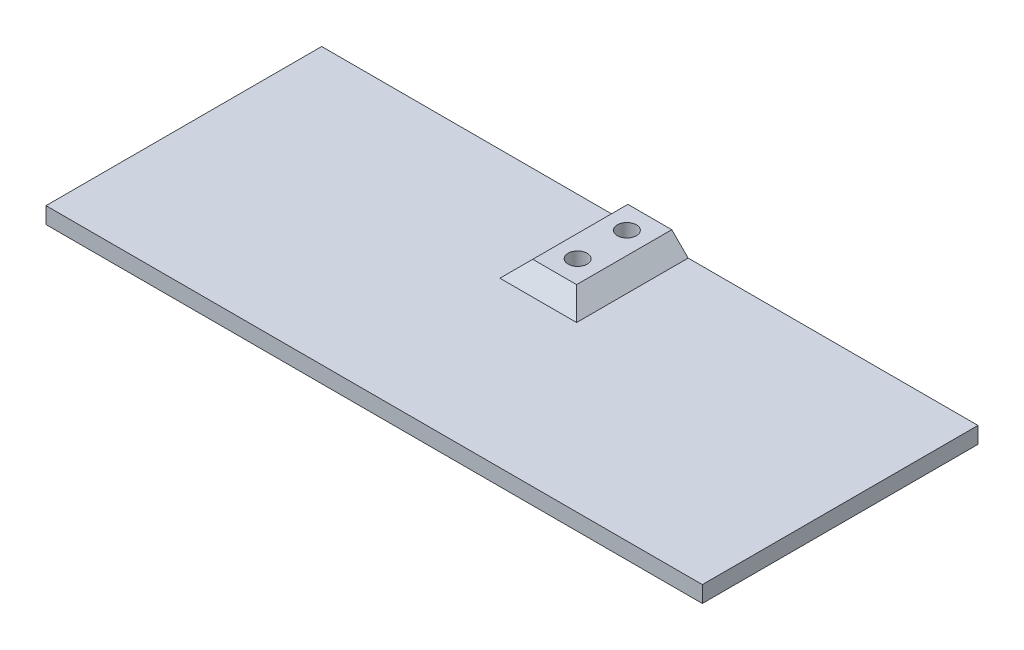
ISO-10303-21;
HEADER;
FILE_DESCRIPTION(('STEP AP214'),'2;1');
FILE_NAME('part.step','',(''),(''),'','','');
FILE_SCHEMA(('AUTOMOTIVE_DESIGN { 1 0 10303 214 1 1 1 1 }'));
ENDSEC;
DATA;
#1=APPLICATION_CONTEXT('core data for automotive mechanical design processes');
#2=APPLICATION_PROTOCOL_DEFINITION('international standard','automotive_design',2000,#1);
#3=PRODUCT_CONTEXT('',#1,'mechanical');
#4=PRODUCT('Part','Part','',(#3));
#5=PRODUCT_RELATED_PRODUCT_CATEGORY('part','',(#4));
#6=PRODUCT_DEFINITION_FORMATION('','',#4);
#7=PRODUCT_DEFINITION_CONTEXT('part definition',#1,'design');
#8=PRODUCT_DEFINITION('design','',#6,#7);
#9=PRODUCT_DEFINITION_SHAPE('','',#8);
#10=(LENGTH_UNIT() NAMED_UNIT(*) SI_UNIT(.MILLI.,.METRE.));
#11=(NAMED_UNIT(*) PLANE_ANGLE_UNIT() SI_UNIT($,.RADIAN.));
#12=(NAMED_UNIT(*) SI_UNIT($,.STERADIAN.) SOLID_ANGLE_UNIT());
#13=UNCERTAINTY_MEASURE_WITH_UNIT(LENGTH_MEASURE(1.E-05),#10,'distance_accuracy_value','');
#14=(GEOMETRIC_REPRESENTATION_CONTEXT(3) GLOBAL_UNCERTAINTY_ASSIGNED_CONTEXT((#13)) GLOBAL_UNIT_ASSIGNED_CONTEXT((#10,
#11,#12)) REPRESENTATION_CONTEXT('',''));
#15=CARTESIAN_POINT('',(0.,0.,0.));
#16=DIRECTION('',(0.,0.,1.));
#17=DIRECTION('',(1.,0.,0.));
#18=AXIS2_PLACEMENT_3D('',#15,#16,#17);
#19=CARTESIAN_POINT('',(0.,5.,0.));
#20=DIRECTION('',(0.,-1.,0.));
#21=DIRECTION('',(0.,0.,-1.));
#22=AXIS2_PLACEMENT_3D('',#19,#20,#21);
#23=PLANE('',#22);
#24=DIRECTION('',(-1.,0.,0.));
#25=VECTOR('',#24,1.);
#26=CARTESIAN_POINT('',(-6.68756530825497,5.,-8.00000000000002));
#27=LINE('',#26,#25);
#28=CARTESIAN_POINT('',(11.6875653082549,5.,-8.00000000000003));
#29=VERTEX_POINT('',#28);
#30=CARTESIAN_POINT('',(-11.6875653082549,5.,-8.00000000000002));
#31=VERTEX_POINT('',#30);
#32=EDGE_CURVE('E64',#29,#31,#27,.T.);
#33=ORIENTED_EDGE('',*,*,#32,.T.);
#34=DIRECTION('',(0.,0.,-1.));
#35=VECTOR('',#34,1.);
#36=CARTESIAN_POINT('',(-11.6875653082549,5.,-42.));
#37=LINE('',#36,#35);
#38=CARTESIAN_POINT('',(-11.6875653082549,5.,-42.));
#39=VERTEX_POINT('',#38);
#40=EDGE_CURVE('E119',#31,#39,#37,.T.);
#41=ORIENTED_EDGE('',*,*,#40,.T.);
#42=DIRECTION('',(-1.,0.,0.));
#43=VECTOR('',#42,1.);
#44=CARTESIAN_POINT('',(-100.,5.,-42.));
#45=LINE('',#44,#43);
#46=CARTESIAN_POINT('',(-100.,5.,-42.));
#47=VERTEX_POINT('',#46);
#48=EDGE_CURVE('E152',#39,#47,#45,.T.);
#49=ORIENTED_EDGE('',*,*,#48,.T.);
#50=DIRECTION('',(0.,0.,1.));
#51=VECTOR('',#50,1.);
#52=CARTESIAN_POINT('',(-100.,5.,42.));
#53=LINE('',#52,#51);
#54=CARTESIAN_POINT('',(-100.,5.,42.));
#55=VERTEX_POINT('',#54);
#56=EDGE_CURVE('E157',#47,#55,#53,.T.);
#57=ORIENTED_EDGE('',*,*,#56,.T.);
#58=DIRECTION('',(1.,0.,0.));
#59=VECTOR('',#58,1.);
#60=CARTESIAN_POINT('',(-100.,5.,42.));
#61=LINE('',#60,#59);
#62=CARTESIAN_POINT('',(100.,5.,42.));
#63=VERTEX_POINT('',#62);
#64=EDGE_CURVE('E160',#55,#63,#61,.T.);
#65=ORIENTED_EDGE('',*,*,#64,.T.);
#66=DIRECTION('',(0.,0.,-1.));
#67=VECTOR('',#66,1.);
#68=CARTESIAN_POINT('',(100.,5.,42.));
#69=LINE('',#68,#67);
#70=CARTESIAN_POINT('',(100.,5.,-42.));
#71=VERTEX_POINT('',#70);
#72=EDGE_CURVE('E148',#63,#71,#69,.T.);
#73=ORIENTED_EDGE('',*,*,#72,.T.);
#74=CARTESIAN_POINT('',(11.6875653082549,5.,-42.));
#75=VERTEX_POINT('',#74);
#76=EDGE_CURVE('E154',#71,#75,#45,.T.);
#77=ORIENTED_EDGE('',*,*,#76,.T.);
#78=DIRECTION('',(0.,0.,1.));
#79=VECTOR('',#78,1.);
#80=CARTESIAN_POINT('',(11.6875653082549,5.,-13.));
#81=LINE('',#80,#79);
#82=EDGE_CURVE('E69',#75,#29,#81,.T.);
#83=ORIENTED_EDGE('',*,*,#82,.T.);
#84=EDGE_LOOP('',(#33,#41,#49,#57,#65,#73,#77,#83));
#85=FACE_BOUND('',#84,.T.);
#86=ADVANCED_FACE('F45',(#85),#23,.F.);
#87=CARTESIAN_POINT('',(100.,5.,42.));
#88=DIRECTION('',(-1.,0.,0.));
#89=DIRECTION('',(0.,0.,1.));
#90=AXIS2_PLACEMENT_3D('',#87,#88,#89);
#91=PLANE('',#90);
#92=DIRECTION('',(0.,0.,-1.));
#93=VECTOR('',#92,1.);
#94=CARTESIAN_POINT('',(100.,0.,42.));
#95=LINE('',#94,#93);
#96=CARTESIAN_POINT('',(100.,0.,42.));
#97=VERTEX_POINT('',#96);
#98=CARTESIAN_POINT('',(100.,0.,-42.));
#99=VERTEX_POINT('',#98);
#100=EDGE_CURVE('E147',#97,#99,#95,.T.);
#101=ORIENTED_EDGE('',*,*,#100,.T.);
#102=DIRECTION('',(0.,-1.,0.));
#103=VECTOR('',#102,1.);
#104=CARTESIAN_POINT('',(100.,5.,-42.));
#105=LINE('',#104,#103);
#106=EDGE_CURVE('E186',#71,#99,#105,.T.);
#107=ORIENTED_EDGE('',*,*,#106,.F.);
#108=ORIENTED_EDGE('',*,*,#72,.F.);
#109=DIRECTION('',(0.,-1.,0.));
#110=VECTOR('',#109,1.);
#111=CARTESIAN_POINT('',(100.,5.,42.));
#112=LINE('',#111,#110);
#113=EDGE_CURVE('E163',#63,#97,#112,.T.);
#114=ORIENTED_EDGE('',*,*,#113,.T.);
#115=EDGE_LOOP('',(#101,#107,#108,#114));
#116=FACE_BOUND('',#115,.T.);
#117=ADVANCED_FACE('F217',(#116),#91,.F.);
#118=CARTESIAN_POINT('',(-100.,5.,-42.));
#119=DIRECTION('',(0.,0.,1.));
#120=DIRECTION('',(1.,0.,0.));
#121=AXIS2_PLACEMENT_3D('',#118,#119,#120);
#122=PLANE('',#121);
#123=DIRECTION('',(-1.,0.,0.));
#124=VECTOR('',#123,1.);
#125=CARTESIAN_POINT('',(-100.,0.,-42.));
#126=LINE('',#125,#124);
#127=CARTESIAN_POINT('',(-100.,0.,-42.));
#128=VERTEX_POINT('',#127);
#129=EDGE_CURVE('E167',#99,#128,#126,.T.);
#130=ORIENTED_EDGE('',*,*,#129,.T.);
#131=DIRECTION('',(0.,-1.,0.));
#132=VECTOR('',#131,1.);
#133=CARTESIAN_POINT('',(-100.,5.,-42.));
#134=LINE('',#133,#132);
#135=EDGE_CURVE('E182',#47,#128,#134,.T.);
#136=ORIENTED_EDGE('',*,*,#135,.F.);
#137=ORIENTED_EDGE('',*,*,#48,.F.);
#138=DIRECTION('',(-0.707106781186544,-0.707106781186552,0.));
#139=VECTOR('',#138,1.);
#140=CARTESIAN_POINT('',(-55.843782654127,-39.1562173458725,-42.));
#141=LINE('',#140,#139);
#142=CARTESIAN_POINT('',(-6.68756530825497,10.,-42.));
#143=VERTEX_POINT('',#142);
#144=EDGE_CURVE('E56',#39,#143,#141,.F.);
#145=ORIENTED_EDGE('',*,*,#144,.T.);
#146=DIRECTION('',(-1.,0.,0.));
#147=VECTOR('',#146,1.);
#148=CARTESIAN_POINT('',(-6.68756530825497,10.,-42.));
#149=LINE('',#148,#147);
#150=CARTESIAN_POINT('',(6.68756530825497,10.,-42.));
#151=VERTEX_POINT('',#150);
#152=EDGE_CURVE('E133',#151,#143,#149,.T.);
#153=ORIENTED_EDGE('',*,*,#152,.F.);
#154=DIRECTION('',(-0.707106781186544,0.707106781186552,0.));
#155=VECTOR('',#154,1.);
#156=CARTESIAN_POINT('',(-44.1562173458719,60.8437826541275,-42.));
#157=LINE('',#156,#155);
#158=EDGE_CURVE('E11',#151,#75,#157,.F.);
#159=ORIENTED_EDGE('',*,*,#158,.T.);
#160=ORIENTED_EDGE('',*,*,#76,.F.);
#161=ORIENTED_EDGE('',*,*,#106,.T.);
#162=EDGE_LOOP('',(#130,#136,#137,#145,#153,#159,#160,#161));
#163=FACE_BOUND('',#162,.T.);
#164=ADVANCED_FACE('F199',(#163),#122,.F.);
#165=CARTESIAN_POINT('',(-100.,5.,42.));
#166=DIRECTION('',(1.,0.,0.));
#167=DIRECTION('',(0.,0.,-1.));
#168=AXIS2_PLACEMENT_3D('',#165,#166,#167);
#169=PLANE('',#168);
#170=DIRECTION('',(0.,0.,1.));
#171=VECTOR('',#170,1.);
#172=CARTESIAN_POINT('',(-100.,0.,42.));
#173=LINE('',#172,#171);
#174=CARTESIAN_POINT('',(-100.,0.,42.));
#175=VERTEX_POINT('',#174);
#176=EDGE_CURVE('E170',#128,#175,#173,.T.);
#177=ORIENTED_EDGE('',*,*,#176,.T.);
#178=DIRECTION('',(0.,-1.,0.));
#179=VECTOR('',#178,1.);
#180=CARTESIAN_POINT('',(-100.,5.,42.));
#181=LINE('',#180,#179);
#182=EDGE_CURVE('E178',#55,#175,#181,.T.);
#183=ORIENTED_EDGE('',*,*,#182,.F.);
#184=ORIENTED_EDGE('',*,*,#56,.F.);
#185=ORIENTED_EDGE('',*,*,#135,.T.);
#186=EDGE_LOOP('',(#177,#183,#184,#185));
#187=FACE_BOUND('',#186,.T.);
#188=ADVANCED_FACE('F208',(#187),#169,.F.);
#189=CARTESIAN_POINT('',(-100.,5.,42.));
#190=DIRECTION('',(0.,0.,-1.));
#191=DIRECTION('',(-1.,0.,0.));
#192=AXIS2_PLACEMENT_3D('',#189,#190,#191);
#193=PLANE('',#192);
#194=DIRECTION('',(1.,0.,0.));
#195=VECTOR('',#194,1.);
#196=CARTESIAN_POINT('',(-100.,0.,42.));
#197=LINE('',#196,#195);
#198=EDGE_CURVE('E153',#175,#97,#197,.T.);
#199=ORIENTED_EDGE('',*,*,#198,.T.);
#200=ORIENTED_EDGE('',*,*,#113,.F.);
#201=ORIENTED_EDGE('',*,*,#64,.F.);
#202=ORIENTED_EDGE('',*,*,#182,.T.);
#203=EDGE_LOOP('',(#199,#200,#201,#202));
#204=FACE_BOUND('',#203,.T.);
#205=ADVANCED_FACE('F212',(#204),#193,.F.);
#206=CARTESIAN_POINT('',(0.,0.,0.));
#207=DIRECTION('',(0.,-1.,0.));
#208=DIRECTION('',(0.,0.,-1.));
#209=AXIS2_PLACEMENT_3D('',#206,#207,#208);
#210=PLANE('',#209);
#211=CARTESIAN_POINT('',(0.,0.,-35.));
#212=DIRECTION('',(0.,-1.,0.));
#213=DIRECTION('',(0.,0.,-1.));
#214=AXIS2_PLACEMENT_3D('',#211,#212,#213);
#215=CIRCLE('',#214,5.025);
#216=CARTESIAN_POINT('',(0.,0.,-40.025));
#217=VERTEX_POINT('',#216);
#218=EDGE_CURVE('E220',#217,#217,#215,.T.);
#219=ORIENTED_EDGE('',*,*,#218,.F.);
#220=EDGE_LOOP('',(#219));
#221=FACE_BOUND('',#220,.T.);
#222=CARTESIAN_POINT('',(0.,0.,-20.));
#223=DIRECTION('',(0.,-1.,0.));
#224=DIRECTION('',(0.,0.,-1.));
#225=AXIS2_PLACEMENT_3D('',#222,#223,#224);
#226=CIRCLE('',#225,5.025);
#227=CARTESIAN_POINT('',(0.,0.,-25.025));
#228=VERTEX_POINT('',#227);
#229=EDGE_CURVE('E243',#228,#228,#226,.T.);
#230=ORIENTED_EDGE('',*,*,#229,.F.);
#231=EDGE_LOOP('',(#230));
#232=FACE_BOUND('',#231,.T.);
#233=ORIENTED_EDGE('',*,*,#100,.F.);
#234=ORIENTED_EDGE('',*,*,#198,.F.);
#235=ORIENTED_EDGE('',*,*,#176,.F.);
#236=ORIENTED_EDGE('',*,*,#129,.F.);
#237=EDGE_LOOP('',(#233,#234,#235,#236));
#238=FACE_BOUND('',#237,.T.);
#239=ADVANCED_FACE('F279',(#221,#232,#238),#210,.T.);
#240=CARTESIAN_POINT('',(0.,10.,0.));
#241=DIRECTION('',(0.,1.,0.));
#242=DIRECTION('',(0.,0.,1.));
#243=AXIS2_PLACEMENT_3D('',#240,#241,#242);
#244=PLANE('',#243);
#245=CARTESIAN_POINT('',(0.,10.,-35.));
#246=DIRECTION('',(0.,-1.,0.));
#247=DIRECTION('',(0.,0.,-1.));
#248=AXIS2_PLACEMENT_3D('',#245,#246,#247);
#249=CIRCLE('',#248,2.9);
#250=CARTESIAN_POINT('',(0.,10.,-37.9));
#251=VERTEX_POINT('',#250);
#252=EDGE_CURVE('E239',#251,#251,#249,.T.);
#253=ORIENTED_EDGE('',*,*,#252,.T.);
#254=EDGE_LOOP('',(#253));
#255=FACE_BOUND('',#254,.T.);
#256=CARTESIAN_POINT('',(0.,10.,-20.));
#257=DIRECTION('',(0.,-1.,0.));
#258=DIRECTION('',(0.,0.,-1.));
#259=AXIS2_PLACEMENT_3D('',#256,#257,#258);
#260=CIRCLE('',#259,2.9);
#261=CARTESIAN_POINT('',(0.,10.,-22.9));
#262=VERTEX_POINT('',#261);
#263=EDGE_CURVE('E135',#262,#262,#260,.T.);
#264=ORIENTED_EDGE('',*,*,#263,.T.);
#265=EDGE_LOOP('',(#264));
#266=FACE_BOUND('',#265,.T.);
#267=DIRECTION('',(0.,0.,1.));
#268=VECTOR('',#267,1.);
#269=CARTESIAN_POINT('',(-6.68756530825497,10.,-42.));
#270=LINE('',#269,#268);
#271=CARTESIAN_POINT('',(-6.68756530825497,10.,-13.));
#272=VERTEX_POINT('',#271);
#273=EDGE_CURVE('E118',#143,#272,#270,.T.);
#274=ORIENTED_EDGE('',*,*,#273,.T.);
#275=DIRECTION('',(1.,0.,0.));
#276=VECTOR('',#275,1.);
#277=CARTESIAN_POINT('',(-6.68756530825497,10.,-13.));
#278=LINE('',#277,#276);
#279=CARTESIAN_POINT('',(6.68756530825497,10.,-13.));
#280=VERTEX_POINT('',#279);
#281=EDGE_CURVE('E123',#272,#280,#278,.T.);
#282=ORIENTED_EDGE('',*,*,#281,.T.);
#283=DIRECTION('',(0.,0.,-1.));
#284=VECTOR('',#283,1.);
#285=CARTESIAN_POINT('',(6.68756530825497,10.,-42.));
#286=LINE('',#285,#284);
#287=EDGE_CURVE('E128',#280,#151,#286,.T.);
#288=ORIENTED_EDGE('',*,*,#287,.T.);
#289=ORIENTED_EDGE('',*,*,#152,.T.);
#290=EDGE_LOOP('',(#274,#282,#288,#289));
#291=FACE_BOUND('',#290,.T.);
#292=ADVANCED_FACE('F131',(#255,#266,#291),#244,.T.);
#293=CARTESIAN_POINT('',(0.,0.,-20.));
#294=DIRECTION('',(0.,-1.,0.));
#295=DIRECTION('',(0.,0.,-1.));
#296=AXIS2_PLACEMENT_3D('',#293,#294,#295);
#297=CYLINDRICAL_SURFACE('',#296,2.9);
#298=ORIENTED_EDGE('',*,*,#263,.F.);
#299=EDGE_LOOP('',(#298));
#300=FACE_BOUND('',#299,.T.);
#301=CARTESIAN_POINT('',(0.,5.,-20.));
#302=DIRECTION('',(0.,-1.,0.));
#303=DIRECTION('',(0.,0.,-1.));
#304=AXIS2_PLACEMENT_3D('',#301,#302,#303);
#305=CIRCLE('',#304,2.9);
#306=CARTESIAN_POINT('',(0.,5.,-22.9));
#307=VERTEX_POINT('',#306);
#308=EDGE_CURVE('E139',#307,#307,#305,.T.);
#309=ORIENTED_EDGE('',*,*,#308,.T.);
#310=EDGE_LOOP('',(#309));
#311=FACE_BOUND('',#310,.T.);
#312=ADVANCED_FACE('F258',(#300,#311),#297,.F.);
#313=CARTESIAN_POINT('',(5.,5.,-20.));
#314=DIRECTION('',(0.,1.,0.));
#315=DIRECTION('',(0.,0.,1.));
#316=AXIS2_PLACEMENT_3D('',#313,#314,#315);
#317=PLANE('',#316);
#318=ORIENTED_EDGE('',*,*,#308,.F.);
#319=EDGE_LOOP('',(#318));
#320=FACE_BOUND('',#319,.T.);
#321=CARTESIAN_POINT('',(0.,5.,-20.));
#322=DIRECTION('',(0.,-1.,0.));
#323=DIRECTION('',(0.,0.,-1.));
#324=AXIS2_PLACEMENT_3D('',#321,#322,#323);
#325=CIRCLE('',#324,5.);
#326=CARTESIAN_POINT('',(0.,5.,-25.));
#327=VERTEX_POINT('',#326);
#328=EDGE_CURVE('E251',#327,#327,#325,.T.);
#329=ORIENTED_EDGE('',*,*,#328,.T.);
#330=EDGE_LOOP('',(#329));
#331=FACE_BOUND('',#330,.T.);
#332=ADVANCED_FACE('F260',(#320,#331),#317,.F.);
#333=CARTESIAN_POINT('',(0.,0.,-20.));
#334=DIRECTION('',(0.,-1.,0.));
#335=DIRECTION('',(0.,0.,-1.));
#336=AXIS2_PLACEMENT_3D('',#333,#334,#335);
#337=CYLINDRICAL_SURFACE('',#336,5.);
#338=ORIENTED_EDGE('',*,*,#328,.F.);
#339=EDGE_LOOP('',(#338));
#340=FACE_BOUND('',#339,.T.);
#341=CARTESIAN_POINT('',(0.,0.0209774907794336,-20.));
#342=DIRECTION('',(0.,-1.,0.));
#343=DIRECTION('',(0.,0.,-1.));
#344=AXIS2_PLACEMENT_3D('',#341,#342,#343);
#345=CIRCLE('',#344,5.);
#346=CARTESIAN_POINT('',(0.,0.0209774907794336,-25.));
#347=VERTEX_POINT('',#346);
#348=EDGE_CURVE('E247',#347,#347,#345,.T.);
#349=ORIENTED_EDGE('',*,*,#348,.T.);
#350=EDGE_LOOP('',(#349));
#351=FACE_BOUND('',#350,.T.);
#352=ADVANCED_FACE('F263',(#340,#351),#337,.F.);
#353=CARTESIAN_POINT('',(0.,0.,-20.));
#354=DIRECTION('',(0.,-1.,0.));
#355=DIRECTION('',(0.,0.,-1.));
#356=AXIS2_PLACEMENT_3D('',#353,#354,#355);
#357=CONICAL_SURFACE('',#356,5.025,0.872664625997159);
#358=ORIENTED_EDGE('',*,*,#348,.F.);
#359=EDGE_LOOP('',(#358));
#360=FACE_BOUND('',#359,.T.);
#361=ORIENTED_EDGE('',*,*,#229,.T.);
#362=EDGE_LOOP('',(#361));
#363=FACE_BOUND('',#362,.T.);
#364=ADVANCED_FACE('F269',(#360,#363),#357,.F.);
#365=CARTESIAN_POINT('',(0.,0.,-35.));
#366=DIRECTION('',(0.,-1.,0.));
#367=DIRECTION('',(0.,0.,-1.));
#368=AXIS2_PLACEMENT_3D('',#365,#366,#367);
#369=CYLINDRICAL_SURFACE('',#368,2.9);
#370=ORIENTED_EDGE('',*,*,#252,.F.);
#371=EDGE_LOOP('',(#370));
#372=FACE_BOUND('',#371,.T.);
#373=CARTESIAN_POINT('',(0.,5.,-35.));
#374=DIRECTION('',(0.,-1.,0.));
#375=DIRECTION('',(0.,0.,-1.));
#376=AXIS2_PLACEMENT_3D('',#373,#374,#375);
#377=CIRCLE('',#376,2.9);
#378=CARTESIAN_POINT('',(0.,5.,-37.9));
#379=VERTEX_POINT('',#378);
#380=EDGE_CURVE('E235',#379,#379,#377,.T.);
#381=ORIENTED_EDGE('',*,*,#380,.T.);
#382=EDGE_LOOP('',(#381));
#383=FACE_BOUND('',#382,.T.);
#384=ADVANCED_FACE('F275',(#372,#383),#369,.F.);
#385=CARTESIAN_POINT('',(5.,5.,-35.));
#386=DIRECTION('',(0.,1.,0.));
#387=DIRECTION('',(0.,0.,1.));
#388=AXIS2_PLACEMENT_3D('',#385,#386,#387);
#389=PLANE('',#388);
#390=ORIENTED_EDGE('',*,*,#380,.F.);
#391=EDGE_LOOP('',(#390));
#392=FACE_BOUND('',#391,.T.);
#393=CARTESIAN_POINT('',(0.,5.,-35.));
#394=DIRECTION('',(0.,-1.,0.));
#395=DIRECTION('',(0.,0.,-1.));
#396=AXIS2_PLACEMENT_3D('',#393,#394,#395);
#397=CIRCLE('',#396,5.);
#398=CARTESIAN_POINT('',(0.,5.,-40.));
#399=VERTEX_POINT('',#398);
#400=EDGE_CURVE('E229',#399,#399,#397,.T.);
#401=ORIENTED_EDGE('',*,*,#400,.T.);
#402=EDGE_LOOP('',(#401));
#403=FACE_BOUND('',#402,.T.);
#404=ADVANCED_FACE('F303',(#392,#403),#389,.F.);
#405=CARTESIAN_POINT('',(0.,0.,-35.));
#406=DIRECTION('',(0.,-1.,0.));
#407=DIRECTION('',(0.,0.,-1.));
#408=AXIS2_PLACEMENT_3D('',#405,#406,#407);
#409=CYLINDRICAL_SURFACE('',#408,5.);
#410=ORIENTED_EDGE('',*,*,#400,.F.);
#411=EDGE_LOOP('',(#410));
#412=FACE_BOUND('',#411,.T.);
#413=CARTESIAN_POINT('',(0.,0.0209774907794336,-35.));
#414=DIRECTION('',(0.,-1.,0.));
#415=DIRECTION('',(0.,0.,-1.));
#416=AXIS2_PLACEMENT_3D('',#413,#414,#415);
#417=CIRCLE('',#416,5.);
#418=CARTESIAN_POINT('',(0.,0.0209774907794336,-40.));
#419=VERTEX_POINT('',#418);
#420=EDGE_CURVE('E223',#419,#419,#417,.T.);
#421=ORIENTED_EDGE('',*,*,#420,.T.);
#422=EDGE_LOOP('',(#421));
#423=FACE_BOUND('',#422,.T.);
#424=ADVANCED_FACE('F307',(#412,#423),#409,.F.);
#425=CARTESIAN_POINT('',(0.,0.,-35.));
#426=DIRECTION('',(0.,-1.,0.));
#427=DIRECTION('',(0.,0.,-1.));
#428=AXIS2_PLACEMENT_3D('',#425,#426,#427);
#429=CONICAL_SURFACE('',#428,5.025,0.872664625997159);
#430=ORIENTED_EDGE('',*,*,#420,.F.);
#431=EDGE_LOOP('',(#430));
#432=FACE_BOUND('',#431,.T.);
#433=ORIENTED_EDGE('',*,*,#218,.T.);
#434=EDGE_LOOP('',(#433));
#435=FACE_BOUND('',#434,.T.);
#436=ADVANCED_FACE('F311',(#432,#435),#429,.F.);
#437=CARTESIAN_POINT('',(6.68756530825497,10.,-42.));
#438=DIRECTION('',(0.707106781186552,0.707106781186544,0.));
#439=DIRECTION('',(0.,0.,1.));
#440=AXIS2_PLACEMENT_3D('',#437,#438,#439);
#441=PLANE('',#440);
#442=ORIENTED_EDGE('',*,*,#158,.F.);
#443=ORIENTED_EDGE('',*,*,#287,.F.);
#444=DIRECTION('',(0.577350269189624,-0.57735026918963,0.577350269189624));
#445=VECTOR('',#444,1.);
#446=CARTESIAN_POINT('',(-2.97910135841162,19.6666666666667,-22.6666666666666));
#447=LINE('',#446,#445);
#448=EDGE_CURVE('E50',#29,#280,#447,.F.);
#449=ORIENTED_EDGE('',*,*,#448,.F.);
#450=ORIENTED_EDGE('',*,*,#82,.F.);
#451=EDGE_LOOP('',(#442,#443,#449,#450));
#452=FACE_BOUND('',#451,.T.);
#453=ADVANCED_FACE('F48',(#452),#441,.T.);
#454=CARTESIAN_POINT('',(-6.68756530825497,10.,-13.));
#455=DIRECTION('',(0.,0.707106781186544,0.707106781186552));
#456=DIRECTION('',(-1.,0.,0.));
#457=AXIS2_PLACEMENT_3D('',#454,#455,#456);
#458=PLANE('',#457);
#459=ORIENTED_EDGE('',*,*,#448,.T.);
#460=ORIENTED_EDGE('',*,*,#281,.F.);
#461=DIRECTION('',(-0.577350269189624,-0.57735026918963,0.577350269189624));
#462=VECTOR('',#461,1.);
#463=CARTESIAN_POINT('',(-6.68756530825497,10.,-13.));
#464=LINE('',#463,#462);
#465=EDGE_CURVE('E113',#31,#272,#464,.F.);
#466=ORIENTED_EDGE('',*,*,#465,.F.);
#467=ORIENTED_EDGE('',*,*,#32,.F.);
#468=EDGE_LOOP('',(#459,#460,#466,#467));
#469=FACE_BOUND('',#468,.T.);
#470=ADVANCED_FACE('F124',(#469),#458,.T.);
#471=CARTESIAN_POINT('',(-6.68756530825497,10.,-42.));
#472=DIRECTION('',(-0.707106781186552,0.707106781186544,0.));
#473=DIRECTION('',(0.,0.,-1.));
#474=AXIS2_PLACEMENT_3D('',#471,#472,#473);
#475=PLANE('',#474);
#476=ORIENTED_EDGE('',*,*,#144,.F.);
#477=ORIENTED_EDGE('',*,*,#40,.F.);
#478=ORIENTED_EDGE('',*,*,#465,.T.);
#479=ORIENTED_EDGE('',*,*,#273,.F.);
#480=EDGE_LOOP('',(#476,#477,#478,#479));
#481=FACE_BOUND('',#480,.T.);
#482=ADVANCED_FACE('F116',(#481),#475,.T.);
#483=CLOSED_SHELL('',(#86,#117,#164,#188,#205,#239,#292,#312,#332,#352,#364,#384,#404,#424,#436,
#453,#470,#482));
#484=MANIFOLD_SOLID_BREP('B2',#483);
#485=ADVANCED_BREP_SHAPE_REPRESENTATION('',(#18,#484),#14);
#486=SHAPE_DEFINITION_REPRESENTATION(#9,#485);
ENDSEC;
END-ISO-10303-21;
